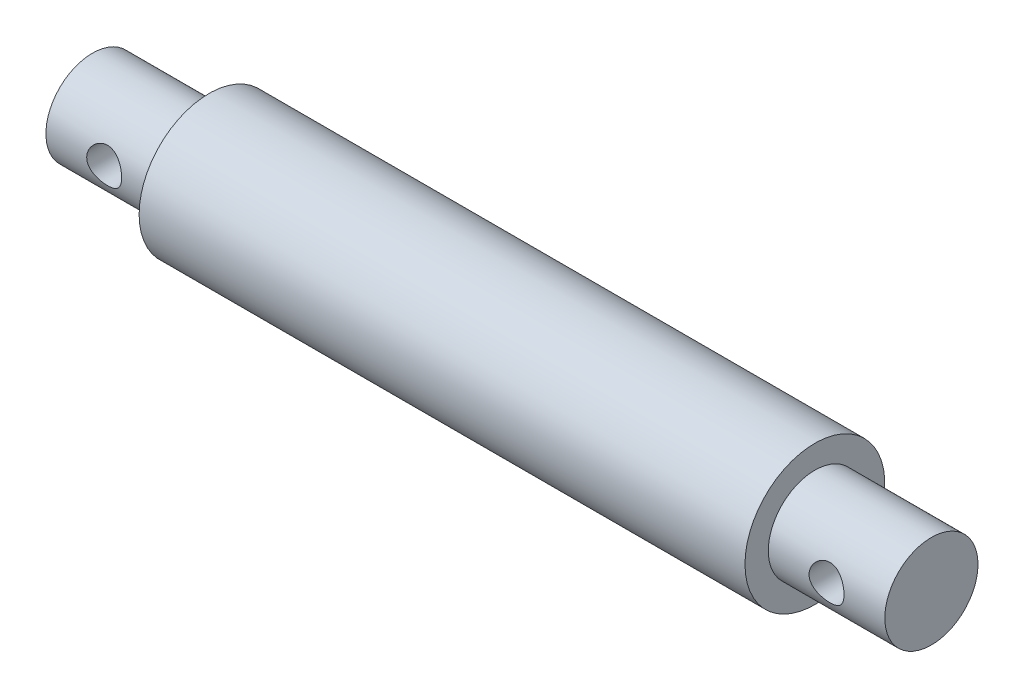
ISO-10303-21;
HEADER;
FILE_DESCRIPTION(('STEP AP214'),'2;1');
FILE_NAME('part.step','',(''),(''),'','','');
FILE_SCHEMA(('AUTOMOTIVE_DESIGN { 1 0 10303 214 1 1 1 1 }'));
ENDSEC;
DATA;
#1=APPLICATION_CONTEXT('core data for automotive mechanical design processes');
#2=APPLICATION_PROTOCOL_DEFINITION('international standard','automotive_design',2000,#1);
#3=PRODUCT_CONTEXT('',#1,'mechanical');
#4=PRODUCT('Part','Part','',(#3));
#5=PRODUCT_RELATED_PRODUCT_CATEGORY('part','',(#4));
#6=PRODUCT_DEFINITION_FORMATION('','',#4);
#7=PRODUCT_DEFINITION_CONTEXT('part definition',#1,'design');
#8=PRODUCT_DEFINITION('design','',#6,#7);
#9=PRODUCT_DEFINITION_SHAPE('','',#8);
#10=(LENGTH_UNIT() NAMED_UNIT(*) SI_UNIT(.MILLI.,.METRE.));
#11=(NAMED_UNIT(*) PLANE_ANGLE_UNIT() SI_UNIT($,.RADIAN.));
#12=(NAMED_UNIT(*) SI_UNIT($,.STERADIAN.) SOLID_ANGLE_UNIT());
#13=UNCERTAINTY_MEASURE_WITH_UNIT(LENGTH_MEASURE(1.E-05),#10,'distance_accuracy_value','');
#14=(GEOMETRIC_REPRESENTATION_CONTEXT(3) GLOBAL_UNCERTAINTY_ASSIGNED_CONTEXT((#13)) GLOBAL_UNIT_ASSIGNED_CONTEXT((#10,
#11,#12)) REPRESENTATION_CONTEXT('',''));
#15=CARTESIAN_POINT('',(0.,0.,0.));
#16=DIRECTION('',(0.,0.,1.));
#17=DIRECTION('',(1.,0.,0.));
#18=AXIS2_PLACEMENT_3D('',#15,#16,#17);
#19=CARTESIAN_POINT('',(5.,0.,0.));
#20=DIRECTION('',(-1.,0.,0.));
#21=DIRECTION('',(0.,0.,1.));
#22=AXIS2_PLACEMENT_3D('',#19,#20,#21);
#23=CYLINDRICAL_SURFACE('',#22,2.);
#24=CARTESIAN_POINT('',(3.24999999999999,0.,2.));
#25=CARTESIAN_POINT('',(3.25000145115156,-0.0406175294689257,2.00000108728076));
#26=CARTESIAN_POINT('',(3.24669011987583,-0.0812251208908955,1.99875189641592));
#27=CARTESIAN_POINT('',(3.23358590236508,-0.161226726176182,1.99389348003464));
#28=CARTESIAN_POINT('',(3.22379394976477,-0.200620913993812,1.99028459446997));
#29=CARTESIAN_POINT('',(3.1981234991142,-0.277030392495449,1.98109416195772));
#30=CARTESIAN_POINT('',(3.18225674158919,-0.314050112081152,1.9755164217472));
#31=CARTESIAN_POINT('',(3.1449467934922,-0.38489965508015,1.96294383882676));
#32=CARTESIAN_POINT('',(3.12350210722804,-0.418728619588968,1.95594861613773));
#33=CARTESIAN_POINT('',(3.07469373446469,-0.483673208522954,1.94093123485607));
#34=CARTESIAN_POINT('',(3.04713486887045,-0.514635365075644,1.93288001291782));
#35=CARTESIAN_POINT('',(2.98729478267075,-0.57162210737188,1.91680110435662));
#36=CARTESIAN_POINT('',(2.95501212195624,-0.597645181796087,1.90877342567514));
#37=CARTESIAN_POINT('',(2.88514126623859,-0.64499101108002,1.89331235308863));
#38=CARTESIAN_POINT('',(2.84739781672729,-0.666096965978905,1.88591324410406));
#39=CARTESIAN_POINT('',(2.76857582291595,-0.701593231670554,1.87299930118712));
#40=CARTESIAN_POINT('',(2.72749861842267,-0.71598622480634,1.86748371487935));
#41=CARTESIAN_POINT('',(2.64494162987112,-0.737042155087917,1.85927206412061));
#42=CARTESIAN_POINT('',(2.6035474807825,-0.743997966092973,1.85646962175412));
#43=CARTESIAN_POINT('',(2.5200919210033,-0.750897782658449,1.85369030730599));
#44=CARTESIAN_POINT('',(2.47803079306298,-0.750844684013374,1.85371226829644));
#45=CARTESIAN_POINT('',(2.39711523739373,-0.743952148050336,1.85648755816018));
#46=CARTESIAN_POINT('',(2.35821954697812,-0.737519042545274,1.85907734435551));
#47=CARTESIAN_POINT('',(2.28210642479755,-0.718720839341929,1.86642469029754));
#48=CARTESIAN_POINT('',(2.24488924669326,-0.706354848316582,1.87118257649421));
#49=CARTESIAN_POINT('',(2.17236146613608,-0.675818742859832,1.88242851095115));
#50=CARTESIAN_POINT('',(2.13710025693954,-0.657543243685829,1.88894758994072));
#51=CARTESIAN_POINT('',(2.0700271312047,-0.615780368813839,1.90297105069648));
#52=CARTESIAN_POINT('',(2.03821641124033,-0.592291193644845,1.91047577228568));
#53=CARTESIAN_POINT('',(1.97669816817473,-0.53890890383313,1.92624019429546));
#54=CARTESIAN_POINT('',(1.94727567962612,-0.508691493585176,1.93451673727825));
#55=CARTESIAN_POINT('',(1.89383101689725,-0.443656295409931,1.95045864082033));
#56=CARTESIAN_POINT('',(1.8698096726973,-0.408837801749113,1.95812390732967));
#57=CARTESIAN_POINT('',(1.82753480146885,-0.334861718496657,1.97213197404533));
#58=CARTESIAN_POINT('',(1.80937620938957,-0.295645356922811,1.97845249129802));
#59=CARTESIAN_POINT('',(1.78000869786505,-0.21441842526275,1.98889359163476));
#60=CARTESIAN_POINT('',(1.76879669171949,-0.172409105423345,1.99301515170742));
#61=CARTESIAN_POINT('',(1.75418860622906,-0.0891876215747927,1.99842221614031));
#62=CARTESIAN_POINT('',(1.75040869680876,-0.0480518097815616,1.99984684512845));
#63=CARTESIAN_POINT('',(1.74965446805002,0.0342862376270601,2.00012946850061));
#64=CARTESIAN_POINT('',(1.75267863984157,0.075488456491236,1.99898803193424));
#65=CARTESIAN_POINT('',(1.76515502115429,0.155131024280497,1.99435854886334));
#66=CARTESIAN_POINT('',(1.77435577186852,0.193616664003252,1.9909623548119));
#67=CARTESIAN_POINT('',(1.79859303627354,0.26847087747817,1.98225738545831));
#68=CARTESIAN_POINT('',(1.81363030897379,0.304839175173286,1.97694836140899));
#69=CARTESIAN_POINT('',(1.84959320621976,0.375623882554734,1.96474812203976));
#70=CARTESIAN_POINT('',(1.87067886461208,0.409951541778737,1.95781500105162));
#71=CARTESIAN_POINT('',(1.91795905158512,0.474696355862675,1.94313335781862));
#72=CARTESIAN_POINT('',(1.94415546627049,0.505112060133928,1.93538453502976));
#73=CARTESIAN_POINT('',(2.00270206106399,0.56301539937286,1.91936664747402));
#74=CARTESIAN_POINT('',(2.03532109139396,0.590230770621167,1.91109348259145));
#75=CARTESIAN_POINT('',(2.10482569234581,0.63885525015548,1.8953940786617));
#76=CARTESIAN_POINT('',(2.14171164566485,0.660263837058458,1.88796791570031));
#77=CARTESIAN_POINT('',(2.21900799340745,0.696688867604872,1.87483414938669));
#78=CARTESIAN_POINT('',(2.25943237304833,0.711678427280095,1.86913380266559));
#79=CARTESIAN_POINT('',(2.34250488194133,0.734539417380815,1.86027016547269));
#80=CARTESIAN_POINT('',(2.38515161812898,0.742415251539542,1.85710530555177));
#81=CARTESIAN_POINT('',(2.46850807975134,0.750431735478515,1.85387947371536));
#82=CARTESIAN_POINT('',(2.50916631585312,0.751036657476174,1.85363222255052));
#83=CARTESIAN_POINT('',(2.58997265814292,0.745683578210571,1.85579206379281));
#84=CARTESIAN_POINT('',(2.6301208123369,0.739726199251178,1.85819890451207));
#85=CARTESIAN_POINT('',(2.70752361335676,0.721779078150335,1.86524070791026));
#86=CARTESIAN_POINT('',(2.74482917312211,0.709978991582282,1.86980542687882));
#87=CARTESIAN_POINT('',(2.81695275424736,0.680848483899663,1.88060774149383));
#88=CARTESIAN_POINT('',(2.85177014403497,0.663516664724658,1.88684575997737));
#89=CARTESIAN_POINT('',(2.91991339484853,0.622760379690614,1.90069861951854));
#90=CARTESIAN_POINT('',(2.95306539839975,0.599064164014947,1.9083684922045));
#91=CARTESIAN_POINT('',(3.01507078048547,0.546672428649476,1.92403123378626));
#92=CARTESIAN_POINT('',(3.04392278739323,0.517975320063985,1.93202420471584));
#93=CARTESIAN_POINT('',(3.09810097791077,0.454540198392265,1.94795212304931));
#94=CARTESIAN_POINT('',(3.1231518767172,0.419559322106461,1.95586052450321));
#95=CARTESIAN_POINT('',(3.16701132763817,0.345606611600394,1.97027257228518));
#96=CARTESIAN_POINT('',(3.18581939386809,0.306634467045301,1.97677610925781));
#97=CARTESIAN_POINT('',(3.21718841452409,0.223999541001155,1.98787146303339));
#98=CARTESIAN_POINT('',(3.22944353230089,0.180206711117105,1.99236828579178));
#99=CARTESIAN_POINT('',(3.24584647996031,0.0909378668031935,1.99843121089794));
#100=CARTESIAN_POINT('',(3.24999837574364,0.0454627081824313,1.99999878301984));
#101=CARTESIAN_POINT('',(3.24999999999999,0.,2.));
#102=B_SPLINE_CURVE_WITH_KNOTS('',3,(#24,#25,#26,#27,#28,#29,#30,#31,#32,#33,#34,#35,#36,#37,
#38,#39,#40,#41,#42,#43,#44,#45,#46,#47,#48,#49,#50,#51,#52,#53,#54,#55,#56,#57,#58,#59,#60,#61,
#62,#63,#64,#65,#66,#67,#68,#69,#70,#71,#72,#73,#74,#75,#76,#77,#78,#79,#80,#81,#82,#83,#84,#85,
#86,#87,#88,#89,#90,#91,#92,#93,#94,#95,#96,#97,#98,#99,#100,#101),.UNSPECIFIED.,.T.,.F.,(4,2,2,
2,2,2,2,2,2,2,2,2,2,2,2,2,2,2,2,2,2,2,2,2,2,2,2,2,2,2,2,2,2,2,2,2,2,2,4),(0.,0.121684900780278,
0.243352274765226,0.36478568460678,0.486251689804735,0.612368092913565,0.738523024628093,
0.869483372508282,1.00039134676066,1.12592937208451,1.25141553039854,1.36939172559986,
1.48738569030295,1.60761204193508,1.72787995372127,1.85623076667904,1.9846012895253,
2.11495687643035,2.24525449849421,2.36862509817962,2.49196834195261,2.61057218961921,
2.72919146627228,2.851296109298,2.97344590009933,3.10268259727827,3.23193089460067,
3.36171533360997,3.49141937472666,3.6127938173454,3.73415675100044,3.85181571207682,
3.96950443322669,4.09336235936551,4.21725970992945,4.34786164821433,4.47847374896964,
4.61474257510435,4.75094300892478),.UNSPECIFIED.);
#103=CARTESIAN_POINT('',(3.24999999999999,0.,2.));
#104=VERTEX_POINT('',#103);
#105=EDGE_CURVE('E45',#104,#104,#102,.T.);
#106=ORIENTED_EDGE('',*,*,#105,.T.);
#107=EDGE_LOOP('',(#106));
#108=FACE_BOUND('',#107,.T.);
#109=CARTESIAN_POINT('',(3.24999999999999,-2.16778004708061E-13,-2.));
#110=CARTESIAN_POINT('',(3.25000145115155,0.0406175294687087,-2.00000108728076));
#111=CARTESIAN_POINT('',(3.2466901198758,0.0812251208906775,-1.99875189641593));
#112=CARTESIAN_POINT('',(3.23358590236503,0.16122672617596,-1.99389348003466));
#113=CARTESIAN_POINT('',(3.22379394976471,0.200620913993587,-1.99028459446999));
#114=CARTESIAN_POINT('',(3.19812349911412,0.277030392495218,-1.98109416195776));
#115=CARTESIAN_POINT('',(3.1822567415891,0.314050112080917,-1.97551642174724));
#116=CARTESIAN_POINT('',(3.14494679349209,0.384899655079905,-1.96294383882681));
#117=CARTESIAN_POINT('',(3.12350210722792,0.418728619588718,-1.95594861613779));
#118=CARTESIAN_POINT('',(3.07469373446454,0.48367320852269,-1.94093123485614));
#119=CARTESIAN_POINT('',(3.0471348688703,0.514635365075373,-1.93288001291789));
#120=CARTESIAN_POINT('',(2.98729478267058,0.571622107371592,-1.9168011043567));
#121=CARTESIAN_POINT('',(2.95501212195606,0.597645181795789,-1.90877342567524));
#122=CARTESIAN_POINT('',(2.8851412662384,0.644991011079701,-1.89331235308874));
#123=CARTESIAN_POINT('',(2.8473978167271,0.666096965978574,-1.88591324410417));
#124=CARTESIAN_POINT('',(2.76857582291575,0.701593231670198,-1.87299930118725));
#125=CARTESIAN_POINT('',(2.72749861842246,0.715986224805973,-1.86748371487949));
#126=CARTESIAN_POINT('',(2.64494162987091,0.737042155087524,-1.85927206412077));
#127=CARTESIAN_POINT('',(2.60354748078229,0.743997966092569,-1.85646962175428));
#128=CARTESIAN_POINT('',(2.52009192100309,0.750897782658021,-1.85369030730616));
#129=CARTESIAN_POINT('',(2.47803079306277,0.750844684012935,-1.85371226829661));
#130=CARTESIAN_POINT('',(2.39711523739353,0.743952148049874,-1.85648755816036));
#131=CARTESIAN_POINT('',(2.35821954697792,0.737519042544801,-1.8590773443557));
#132=CARTESIAN_POINT('',(2.28210642479734,0.718720839341434,-1.86642469029773));
#133=CARTESIAN_POINT('',(2.24488924669306,0.706354848316075,-1.8711825764944));
#134=CARTESIAN_POINT('',(2.17236146613588,0.675818742859302,-1.88242851095134));
#135=CARTESIAN_POINT('',(2.13710025693934,0.657543243685285,-1.88894758994091));
#136=CARTESIAN_POINT('',(2.07002713120451,0.615780368813268,-1.90297105069667));
#137=CARTESIAN_POINT('',(2.03821641124014,0.592291193644261,-1.91047577228586));
#138=CARTESIAN_POINT('',(1.97669816817455,0.538908903832521,-1.92624019429563));
#139=CARTESIAN_POINT('',(1.94727567962594,0.508691493584554,-1.93451673727841));
#140=CARTESIAN_POINT('',(1.89383101689709,0.443656295409285,-1.95045864082048));
#141=CARTESIAN_POINT('',(1.86980967269716,0.408837801748457,-1.95812390732981));
#142=CARTESIAN_POINT('',(1.82753480146873,0.334861718495984,-1.97213197404544));
#143=CARTESIAN_POINT('',(1.80937620938946,0.295645356922135,-1.97845249129812));
#144=CARTESIAN_POINT('',(1.78000869786497,0.214418425262069,-1.98889359163483));
#145=CARTESIAN_POINT('',(1.76879669171944,0.172409105422662,-1.99301515170748));
#146=CARTESIAN_POINT('',(1.75418860622903,0.089187621574113,-1.99842221614034));
#147=CARTESIAN_POINT('',(1.75040869680874,0.0480518097808855,-1.99984684512846));
#148=CARTESIAN_POINT('',(1.74965446805003,-0.0342862376277258,-2.0001294685006));
#149=CARTESIAN_POINT('',(1.7526786398416,-0.0754884564918951,-1.99898803193422));
#150=CARTESIAN_POINT('',(1.76515502115434,-0.155131024281146,-1.99435854886329));
#151=CARTESIAN_POINT('',(1.77435577186857,-0.193616664003896,-1.99096235481184));
#152=CARTESIAN_POINT('',(1.79859303627362,-0.268470877478804,-1.98225738545823));
#153=CARTESIAN_POINT('',(1.81363030897388,-0.304839175173914,-1.97694836140889));
#154=CARTESIAN_POINT('',(1.84959320621987,-0.375623882555352,-1.96474812203964));
#155=CARTESIAN_POINT('',(1.8706788646122,-0.409951541779351,-1.95781500105149));
#156=CARTESIAN_POINT('',(1.91795905158526,-0.474696355863281,-1.94313335781847));
#157=CARTESIAN_POINT('',(1.94415546627064,-0.505112060134527,-1.9353845350296));
#158=CARTESIAN_POINT('',(2.00270206106417,-0.563015399373447,-1.91936664747385));
#159=CARTESIAN_POINT('',(2.03532109139414,-0.590230770621746,-1.91109348259127));
#160=CARTESIAN_POINT('',(2.10482569234602,-0.638855250156041,-1.89539407866151));
#161=CARTESIAN_POINT('',(2.14171164566507,-0.66026383705901,-1.88796791570011));
#162=CARTESIAN_POINT('',(2.21900799340769,-0.6966888676054,-1.8748341493865));
#163=CARTESIAN_POINT('',(2.25943237304857,-0.711678427280609,-1.8691338026654));
#164=CARTESIAN_POINT('',(2.34250488194157,-0.734539417381301,-1.8602701654725));
#165=CARTESIAN_POINT('',(2.38515161812923,-0.742415251540014,-1.85710530555158));
#166=CARTESIAN_POINT('',(2.46850807975159,-0.750431735478958,-1.85387947371518));
#167=CARTESIAN_POINT('',(2.50916631585336,-0.751036657476604,-1.85363222255035));
#168=CARTESIAN_POINT('',(2.58997265814315,-0.745683578210976,-1.85579206379264));
#169=CARTESIAN_POINT('',(2.63012081233713,-0.739726199251572,-1.85819890451191));
#170=CARTESIAN_POINT('',(2.70752361335697,-0.721779078150708,-1.86524070791011));
#171=CARTESIAN_POINT('',(2.74482917312231,-0.709978991582646,-1.86980542687868));
#172=CARTESIAN_POINT('',(2.81695275424754,-0.68084848390001,-1.8806077414937));
#173=CARTESIAN_POINT('',(2.85177014403515,-0.663516664724997,-1.88684575997725));
#174=CARTESIAN_POINT('',(2.9199133948487,-0.622760379690938,-1.90069861951844));
#175=CARTESIAN_POINT('',(2.95306539839991,-0.599064164015262,-1.9083684922044));
#176=CARTESIAN_POINT('',(3.01507078048561,-0.546672428649775,-1.92403123378618));
#177=CARTESIAN_POINT('',(3.04392278739336,-0.517975320064277,-1.93202420471576));
#178=CARTESIAN_POINT('',(3.09810097791089,-0.454540198392541,-1.94795212304925));
#179=CARTESIAN_POINT('',(3.12315187671732,-0.419559322106729,-1.95586052450315));
#180=CARTESIAN_POINT('',(3.16701132763826,-0.345606611600647,-1.97027257228514));
#181=CARTESIAN_POINT('',(3.18581939386817,-0.306634467045547,-1.97677610925777));
#182=CARTESIAN_POINT('',(3.21718841452415,-0.223999541001389,-1.98787146303337));
#183=CARTESIAN_POINT('',(3.22944353230094,-0.180206711117334,-1.99236828579176));
#184=CARTESIAN_POINT('',(3.24584647996033,-0.0909378668034148,-1.99843121089793));
#185=CARTESIAN_POINT('',(3.24999837574366,-0.0454627081826498,-1.99999878301983));
#186=CARTESIAN_POINT('',(3.24999999999999,-2.16778004708061E-13,-2.));
#187=B_SPLINE_CURVE_WITH_KNOTS('',3,(#109,#110,#111,#112,#113,#114,#115,#116,#117,#118,#119,
#120,#121,#122,#123,#124,#125,#126,#127,#128,#129,#130,#131,#132,#133,#134,#135,#136,#137,#138,
#139,#140,#141,#142,#143,#144,#145,#146,#147,#148,#149,#150,#151,#152,#153,#154,#155,#156,#157,
#158,#159,#160,#161,#162,#163,#164,#165,#166,#167,#168,#169,#170,#171,#172,#173,#174,#175,#176,
#177,#178,#179,#180,#181,#182,#183,#184,#185,#186),.UNSPECIFIED.,.T.,.F.,(4,2,2,2,2,2,2,2,2,2,2,
2,2,2,2,2,2,2,2,2,2,2,2,2,2,2,2,2,2,2,2,2,2,2,2,2,2,2,4),(0.,0.121684900780277,
0.243352274765224,0.364785684606778,0.486251689804733,0.612368092913561,0.738523024628086,
0.869483372508267,1.00039134676064,1.12592937208448,1.25141553039851,1.36939172559983,
1.48738569030293,1.60761204193508,1.72787995372128,1.85623076667905,1.98460128952532,
2.11495687643036,2.24525449849421,2.3686250981796,2.49196834195257,2.61057218961917,
2.72919146627223,2.85129610929797,2.97344590009931,3.10268259727827,3.23193089460069,
3.36171533360998,3.49141937472667,3.61279381734539,3.73415675100043,3.85181571207679,
3.96950443322665,4.09336235936547,4.21725970992942,4.34786164821431,4.47847374896963,
4.61474257510434,4.75094300892478),.UNSPECIFIED.);
#188=CARTESIAN_POINT('',(3.24999999999999,-2.16778004708061E-13,-2.));
#189=VERTEX_POINT('',#188);
#190=EDGE_CURVE('E104',#189,#189,#187,.T.);
#191=ORIENTED_EDGE('',*,*,#190,.T.);
#192=EDGE_LOOP('',(#191));
#193=FACE_BOUND('',#192,.T.);
#194=CARTESIAN_POINT('',(5.,0.,0.));
#195=DIRECTION('',(1.,0.,0.));
#196=DIRECTION('',(0.,0.,-1.));
#197=AXIS2_PLACEMENT_3D('',#194,#195,#196);
#198=CIRCLE('',#197,2.);
#199=CARTESIAN_POINT('',(5.,0.,-2.));
#200=VERTEX_POINT('',#199);
#201=EDGE_CURVE('E54',#200,#200,#198,.T.);
#202=ORIENTED_EDGE('',*,*,#201,.F.);
#203=EDGE_LOOP('',(#202));
#204=FACE_BOUND('',#203,.T.);
#205=CARTESIAN_POINT('',(0.,0.,0.));
#206=DIRECTION('',(1.,0.,0.));
#207=DIRECTION('',(0.,0.,-1.));
#208=AXIS2_PLACEMENT_3D('',#205,#206,#207);
#209=CIRCLE('',#208,2.);
#210=CARTESIAN_POINT('',(0.,0.,-2.));
#211=VERTEX_POINT('',#210);
#212=EDGE_CURVE('E60',#211,#211,#209,.T.);
#213=ORIENTED_EDGE('',*,*,#212,.T.);
#214=EDGE_LOOP('',(#213));
#215=FACE_BOUND('',#214,.T.);
#216=ADVANCED_FACE('F41',(#108,#193,#204,#215),#23,.T.);
#217=CARTESIAN_POINT('',(0.,0.,0.));
#218=DIRECTION('',(1.,0.,0.));
#219=DIRECTION('',(0.,0.,-1.));
#220=AXIS2_PLACEMENT_3D('',#217,#218,#219);
#221=PLANE('',#220);
#222=ORIENTED_EDGE('',*,*,#212,.F.);
#223=EDGE_LOOP('',(#222));
#224=FACE_BOUND('',#223,.T.);
#225=ADVANCED_FACE('F132',(#224),#221,.F.);
#226=CARTESIAN_POINT('',(31.,0.,0.));
#227=DIRECTION('',(-1.,0.,0.));
#228=DIRECTION('',(0.,0.,1.));
#229=AXIS2_PLACEMENT_3D('',#226,#227,#228);
#230=CYLINDRICAL_SURFACE('',#229,3.);
#231=CARTESIAN_POINT('',(31.,0.,0.));
#232=DIRECTION('',(1.,0.,0.));
#233=DIRECTION('',(0.,0.,-1.));
#234=AXIS2_PLACEMENT_3D('',#231,#232,#233);
#235=CIRCLE('',#234,3.);
#236=CARTESIAN_POINT('',(31.,0.,3.));
#237=VERTEX_POINT('',#236);
#238=EDGE_CURVE('E65',#237,#237,#235,.T.);
#239=CARTESIAN_POINT('',(5.,0.,0.));
#240=DIRECTION('',(1.,0.,0.));
#241=DIRECTION('',(0.,0.,-1.));
#242=AXIS2_PLACEMENT_3D('',#239,#240,#241);
#243=CIRCLE('',#242,3.);
#244=CARTESIAN_POINT('',(5.,0.,3.));
#245=VERTEX_POINT('',#244);
#246=EDGE_CURVE('E69',#245,#245,#243,.T.);
#247=CARTESIAN_POINT('',(31.,0.,3.));
#248=CARTESIAN_POINT('',(30.7291666666667,0.,3.));
#249=CARTESIAN_POINT('',(30.4583333333333,0.,3.));
#250=CARTESIAN_POINT('',(29.9166666666667,0.,3.));
#251=CARTESIAN_POINT('',(29.6458333333333,0.,3.));
#252=CARTESIAN_POINT('',(29.1041666666667,0.,3.));
#253=CARTESIAN_POINT('',(28.8333333333333,0.,3.));
#254=CARTESIAN_POINT('',(28.2916666666667,0.,3.));
#255=CARTESIAN_POINT('',(28.0208333333333,0.,3.));
#256=CARTESIAN_POINT('',(27.4791666666667,0.,3.));
#257=CARTESIAN_POINT('',(27.2083333333333,0.,3.));
#258=CARTESIAN_POINT('',(26.6666666666667,0.,3.));
#259=CARTESIAN_POINT('',(26.3958333333333,0.,3.));
#260=CARTESIAN_POINT('',(25.8541666666667,0.,3.));
#261=CARTESIAN_POINT('',(25.5833333333333,0.,3.));
#262=CARTESIAN_POINT('',(25.0416666666667,0.,3.));
#263=CARTESIAN_POINT('',(24.7708333333333,0.,3.));
#264=CARTESIAN_POINT('',(24.2291666666667,0.,3.));
#265=CARTESIAN_POINT('',(23.9583333333333,0.,3.));
#266=CARTESIAN_POINT('',(23.4166666666667,0.,3.));
#267=CARTESIAN_POINT('',(23.1458333333333,0.,3.));
#268=CARTESIAN_POINT('',(22.6041666666667,0.,3.));
#269=CARTESIAN_POINT('',(22.3333333333333,0.,3.));
#270=CARTESIAN_POINT('',(21.7916666666667,0.,3.));
#271=CARTESIAN_POINT('',(21.5208333333333,0.,3.));
#272=CARTESIAN_POINT('',(20.9791666666667,0.,3.));
#273=CARTESIAN_POINT('',(20.7083333333333,0.,3.));
#274=CARTESIAN_POINT('',(20.1666666666667,0.,3.));
#275=CARTESIAN_POINT('',(19.8958333333333,0.,3.));
#276=CARTESIAN_POINT('',(19.3541666666667,0.,3.));
#277=CARTESIAN_POINT('',(19.0833333333333,0.,3.));
#278=CARTESIAN_POINT('',(18.5416666666667,0.,3.));
#279=CARTESIAN_POINT('',(18.2708333333333,0.,3.));
#280=CARTESIAN_POINT('',(17.7291666666667,0.,3.));
#281=CARTESIAN_POINT('',(17.4583333333333,0.,3.));
#282=CARTESIAN_POINT('',(16.9166666666667,0.,3.));
#283=CARTESIAN_POINT('',(16.6458333333333,0.,3.));
#284=CARTESIAN_POINT('',(16.1041666666667,0.,3.));
#285=CARTESIAN_POINT('',(15.8333333333333,0.,3.));
#286=CARTESIAN_POINT('',(15.2916666666667,0.,3.));
#287=CARTESIAN_POINT('',(15.0208333333333,0.,3.));
#288=CARTESIAN_POINT('',(14.4791666666667,0.,3.));
#289=CARTESIAN_POINT('',(14.2083333333333,0.,3.));
#290=CARTESIAN_POINT('',(13.6666666666667,0.,3.));
#291=CARTESIAN_POINT('',(13.3958333333333,0.,3.));
#292=CARTESIAN_POINT('',(12.8541666666667,0.,3.));
#293=CARTESIAN_POINT('',(12.5833333333333,0.,3.));
#294=CARTESIAN_POINT('',(12.0416666666667,0.,3.));
#295=CARTESIAN_POINT('',(11.7708333333333,0.,3.));
#296=CARTESIAN_POINT('',(11.2291666666667,0.,3.));
#297=CARTESIAN_POINT('',(10.9583333333333,0.,3.));
#298=CARTESIAN_POINT('',(10.4166666666667,0.,3.));
#299=CARTESIAN_POINT('',(10.1458333333333,0.,3.));
#300=CARTESIAN_POINT('',(9.60416666666667,0.,3.));
#301=CARTESIAN_POINT('',(9.33333333333333,0.,3.));
#302=CARTESIAN_POINT('',(8.79166666666667,0.,3.));
#303=CARTESIAN_POINT('',(8.52083333333333,0.,3.));
#304=CARTESIAN_POINT('',(7.97916666666667,0.,3.));
#305=CARTESIAN_POINT('',(7.70833333333333,0.,3.));
#306=CARTESIAN_POINT('',(7.16666666666667,0.,3.));
#307=CARTESIAN_POINT('',(6.89583333333333,0.,3.));
#308=CARTESIAN_POINT('',(6.35416666666667,0.,3.));
#309=CARTESIAN_POINT('',(6.08333333333334,0.,3.));
#310=CARTESIAN_POINT('',(5.54166666666667,0.,3.));
#311=CARTESIAN_POINT('',(5.27083333333333,0.,3.));
#312=CARTESIAN_POINT('',(5.,0.,3.));
#313=B_SPLINE_CURVE_WITH_KNOTS('',3,(#247,#248,#249,#250,#251,#252,#253,#254,#255,#256,#257,
#258,#259,#260,#261,#262,#263,#264,#265,#266,#267,#268,#269,#270,#271,#272,#273,#274,#275,#276,
#277,#278,#279,#280,#281,#282,#283,#284,#285,#286,#287,#288,#289,#290,#291,#292,#293,#294,#295,
#296,#297,#298,#299,#300,#301,#302,#303,#304,#305,#306,#307,#308,#309,#310,#311,#312),
.UNSPECIFIED.,.F.,.F.,(4,2,2,2,2,2,2,2,2,2,2,2,2,2,2,2,2,2,2,2,2,2,2,2,2,2,2,2,2,2,2,2,4),(0.,
0.812500000000001,1.625,2.4375,3.25,4.0625,4.875,5.6875,6.5,7.3125,8.125,8.9375,9.75,10.5625,
11.375,12.1875,13.,13.8125,14.625,15.4375,16.25,17.0625,17.875,18.6875,19.5,20.3125,21.125,
21.9375,22.75,23.5625,24.375,25.1875,26.),.UNSPECIFIED.);
#314=EDGE_CURVE('BSEAM137',#237,#245,#313,.T.);
#315=ORIENTED_EDGE('',*,*,#238,.F.);
#316=ORIENTED_EDGE('',*,*,#246,.T.);
#317=ORIENTED_EDGE('',*,*,#314,.T.);
#318=ORIENTED_EDGE('',*,*,#314,.F.);
#319=EDGE_LOOP('',(#315,#317,#316,#318));
#320=FACE_BOUND('',#319,.T.);
#321=ADVANCED_FACE('F137',(#320),#230,.T.);
#322=CARTESIAN_POINT('',(31.,0.,0.));
#323=DIRECTION('',(1.,0.,0.));
#324=DIRECTION('',(0.,0.,-1.));
#325=AXIS2_PLACEMENT_3D('',#322,#323,#324);
#326=PLANE('',#325);
#327=CARTESIAN_POINT('',(31.,0.,0.));
#328=DIRECTION('',(1.,0.,0.));
#329=DIRECTION('',(0.,0.,-1.));
#330=AXIS2_PLACEMENT_3D('',#327,#328,#329);
#331=CIRCLE('',#330,2.);
#332=CARTESIAN_POINT('',(31.,0.,-2.));
#333=VERTEX_POINT('',#332);
#334=EDGE_CURVE('E10',#333,#333,#331,.T.);
#335=ORIENTED_EDGE('',*,*,#334,.F.);
#336=EDGE_LOOP('',(#335));
#337=FACE_BOUND('',#336,.T.);
#338=ORIENTED_EDGE('',*,*,#238,.T.);
#339=EDGE_LOOP('',(#338));
#340=FACE_BOUND('',#339,.T.);
#341=ADVANCED_FACE('F147',(#337,#340),#326,.T.);
#342=CARTESIAN_POINT('',(5.,0.,0.));
#343=DIRECTION('',(1.,0.,0.));
#344=DIRECTION('',(0.,0.,-1.));
#345=AXIS2_PLACEMENT_3D('',#342,#343,#344);
#346=PLANE('',#345);
#347=ORIENTED_EDGE('',*,*,#201,.T.);
#348=EDGE_LOOP('',(#347));
#349=FACE_BOUND('',#348,.T.);
#350=ORIENTED_EDGE('',*,*,#246,.F.);
#351=EDGE_LOOP('',(#350));
#352=FACE_BOUND('',#351,.T.);
#353=ADVANCED_FACE('F121',(#349,#352),#346,.F.);
#354=CARTESIAN_POINT('',(36.,0.,0.));
#355=DIRECTION('',(-1.,0.,0.));
#356=DIRECTION('',(0.,0.,1.));
#357=AXIS2_PLACEMENT_3D('',#354,#355,#356);
#358=CYLINDRICAL_SURFACE('',#357,2.);
#359=CARTESIAN_POINT('',(34.25,0.,2.));
#360=CARTESIAN_POINT('',(34.2500014511515,-0.0406175294689268,2.00000108728076));
#361=CARTESIAN_POINT('',(34.2466901198758,-0.081225120890897,1.99875189641592));
#362=CARTESIAN_POINT('',(34.233585902365,-0.161226726176181,1.99389348003464));
#363=CARTESIAN_POINT('',(34.2237939497647,-0.200620913993808,1.99028459446997));
#364=CARTESIAN_POINT('',(34.1981234991141,-0.277030392495442,1.98109416195772));
#365=CARTESIAN_POINT('',(34.1822567415891,-0.314050112081143,1.9755164217472));
#366=CARTESIAN_POINT('',(34.1449467934921,-0.384899655080131,1.96294383882677));
#367=CARTESIAN_POINT('',(34.1235021072279,-0.418728619588942,1.95594861613774));
#368=CARTESIAN_POINT('',(34.0746937344645,-0.483673208522913,1.94093123485608));
#369=CARTESIAN_POINT('',(34.0471348688703,-0.514635365075595,1.93288001291783));
#370=CARTESIAN_POINT('',(33.9872947826706,-0.571622107371815,1.91680110435663));
#371=CARTESIAN_POINT('',(33.9550121219561,-0.597645181796014,1.90877342567516));
#372=CARTESIAN_POINT('',(33.8851412662384,-0.644991011079926,1.89331235308866));
#373=CARTESIAN_POINT('',(33.8473978167271,-0.666096965978799,1.88591324410409));
#374=CARTESIAN_POINT('',(33.7685758229157,-0.701593231670422,1.87299930118717));
#375=CARTESIAN_POINT('',(33.7274986184224,-0.715986224806196,1.8674837148794));
#376=CARTESIAN_POINT('',(33.6449416298709,-0.737042155087745,1.85927206412068));
#377=CARTESIAN_POINT('',(33.6035474807823,-0.743997966092788,1.85646962175419));
#378=CARTESIAN_POINT('',(33.5200919210031,-0.750897782658239,1.85369030730607));
#379=CARTESIAN_POINT('',(33.4780307930628,-0.750844684013151,1.85371226829652));
#380=CARTESIAN_POINT('',(33.3971152373935,-0.743952148050089,1.85648755816027));
#381=CARTESIAN_POINT('',(33.3582195469779,-0.737519042545016,1.85907734435561));
#382=CARTESIAN_POINT('',(33.2821064247973,-0.718720839341648,1.86642469029765));
#383=CARTESIAN_POINT('',(33.244889246693,-0.706354848316289,1.87118257649432));
#384=CARTESIAN_POINT('',(33.1723614661359,-0.675818742859516,1.88242851095127));
#385=CARTESIAN_POINT('',(33.1371002569393,-0.657543243685499,1.88894758994083));
#386=CARTESIAN_POINT('',(33.0700271312045,-0.615780368813486,1.9029710506966));
#387=CARTESIAN_POINT('',(33.0382164112401,-0.592291193644481,1.91047577228579));
#388=CARTESIAN_POINT('',(32.9766981681746,-0.538908903832742,1.92624019429557));
#389=CARTESIAN_POINT('',(32.947275679626,-0.508691493584775,1.93451673727835));
#390=CARTESIAN_POINT('',(32.8938310168971,-0.443656295409507,1.95045864082043));
#391=CARTESIAN_POINT('',(32.8698096726972,-0.408837801748679,1.95812390732976));
#392=CARTESIAN_POINT('',(32.8275348014687,-0.334861718496206,1.9721319740454));
#393=CARTESIAN_POINT('',(32.8093762093895,-0.295645356922356,1.97845249129808));
#394=CARTESIAN_POINT('',(32.780008697865,-0.214418425262288,1.98889359163481));
#395=CARTESIAN_POINT('',(32.7687966917194,-0.172409105422881,1.99301515170746));
#396=CARTESIAN_POINT('',(32.754188606229,-0.0891876215743301,1.99842221614033));
#397=CARTESIAN_POINT('',(32.7504086968087,-0.0480518097811011,1.99984684512846));
#398=CARTESIAN_POINT('',(32.74965446805,0.034286237627513,2.0001294685006));
#399=CARTESIAN_POINT('',(32.7526786398416,0.0754884564916837,1.99898803193422));
#400=CARTESIAN_POINT('',(32.7651550211543,0.155131024280937,1.99435854886331));
#401=CARTESIAN_POINT('',(32.7743557718686,0.193616664003688,1.99096235481185));
#402=CARTESIAN_POINT('',(32.7985930362736,0.268470877478597,1.98225738545826));
#403=CARTESIAN_POINT('',(32.8136303089739,0.304839175173707,1.97694836140892));
#404=CARTESIAN_POINT('',(32.8495932062199,0.375623882555142,1.96474812203968));
#405=CARTESIAN_POINT('',(32.8706788646122,0.40995154177914,1.95781500105154));
#406=CARTESIAN_POINT('',(32.9179590515853,0.474696355863068,1.94313335781852));
#407=CARTESIAN_POINT('',(32.9441554662707,0.505112060134315,1.93538453502966));
#408=CARTESIAN_POINT('',(33.0027020610642,0.563015399373234,1.91936664747391));
#409=CARTESIAN_POINT('',(33.0353210913941,0.590230770621531,1.91109348259133));
#410=CARTESIAN_POINT('',(33.104825692346,0.638855250155824,1.89539407866158));
#411=CARTESIAN_POINT('',(33.1417116456651,0.660263837058794,1.88796791570019));
#412=CARTESIAN_POINT('',(33.2190079934077,0.696688867605184,1.87483414938657));
#413=CARTESIAN_POINT('',(33.2594323730486,0.711678427280394,1.86913380266548));
#414=CARTESIAN_POINT('',(33.3425048819416,0.734539417381085,1.86027016547258));
#415=CARTESIAN_POINT('',(33.3851516181292,0.742415251539797,1.85710530555167));
#416=CARTESIAN_POINT('',(33.4685080797516,0.750431735478741,1.85387947371526));
#417=CARTESIAN_POINT('',(33.5091663158534,0.751036657476387,1.85363222255043));
#418=CARTESIAN_POINT('',(33.5899726581432,0.745683578210759,1.85579206379273));
#419=CARTESIAN_POINT('',(33.6301208123371,0.739726199251355,1.858198904512));
#420=CARTESIAN_POINT('',(33.707523613357,0.721779078150489,1.86524070791019));
#421=CARTESIAN_POINT('',(33.7448291731223,0.709978991582425,1.86980542687876));
#422=CARTESIAN_POINT('',(33.8169527542476,0.680848483899788,1.88060774149378));
#423=CARTESIAN_POINT('',(33.8517701440352,0.663516664724774,1.88684575997732));
#424=CARTESIAN_POINT('',(33.9199133948487,0.622760379690711,1.90069861951851));
#425=CARTESIAN_POINT('',(33.9530653983999,0.599064164015033,1.90836849220447));
#426=CARTESIAN_POINT('',(34.0150707804856,0.546672428649541,1.92403123378624));
#427=CARTESIAN_POINT('',(34.0439227873934,0.517975320064042,1.93202420471582));
#428=CARTESIAN_POINT('',(34.0981009779109,0.454540198392303,1.9479521230493));
#429=CARTESIAN_POINT('',(34.1231518767173,0.419559322106489,1.9558605245032));
#430=CARTESIAN_POINT('',(34.1670113276383,0.345606611600406,1.97027257228518));
#431=CARTESIAN_POINT('',(34.1858193938682,0.306634467045307,1.9767761092578));
#432=CARTESIAN_POINT('',(34.2171884145242,0.223999541001153,1.98787146303339));
#433=CARTESIAN_POINT('',(34.2294435323009,0.180206711117101,1.99236828579178));
#434=CARTESIAN_POINT('',(34.2458464799603,0.0909378668031894,1.99843121089794));
#435=CARTESIAN_POINT('',(34.2499983757437,0.0454627081824288,1.99999878301984));
#436=CARTESIAN_POINT('',(34.25,0.,2.));
#437=B_SPLINE_CURVE_WITH_KNOTS('',3,(#359,#360,#361,#362,#363,#364,#365,#366,#367,#368,#369,
#370,#371,#372,#373,#374,#375,#376,#377,#378,#379,#380,#381,#382,#383,#384,#385,#386,#387,#388,
#389,#390,#391,#392,#393,#394,#395,#396,#397,#398,#399,#400,#401,#402,#403,#404,#405,#406,#407,
#408,#409,#410,#411,#412,#413,#414,#415,#416,#417,#418,#419,#420,#421,#422,#423,#424,#425,#426,
#427,#428,#429,#430,#431,#432,#433,#434,#435,#436),.UNSPECIFIED.,.T.,.F.,(4,2,2,2,2,2,2,2,2,2,2,
2,2,2,2,2,2,2,2,2,2,2,2,2,2,2,2,2,2,2,2,2,2,2,2,2,2,2,4),(0.,0.121684900780281,
0.243352274765231,0.364785684606795,0.486251689804746,0.612368092913578,0.738523024628111,
0.869483372508295,1.00039134676067,1.12592937208451,1.25141553039853,1.36939172559986,
1.48738569030295,1.60761204193509,1.72787995372129,1.85623076667906,1.98460128952533,
2.11495687643038,2.24525449849423,2.36862509817962,2.4919683419526,2.6105721896192,
2.72919146627226,2.85129610929799,2.97344590009933,3.10268259727828,3.2319308946007,
3.36171533361,3.49141937472668,3.61279381734541,3.73415675100045,3.85181571207681,
3.96950443322668,4.0933623593655,4.21725970992946,4.34786164821434,4.47847374896966,
4.61474257510435,4.75094300892478),.UNSPECIFIED.);
#438=CARTESIAN_POINT('',(34.25,0.,2.));
#439=VERTEX_POINT('',#438);
#440=EDGE_CURVE('E85',#439,#439,#437,.T.);
#441=ORIENTED_EDGE('',*,*,#440,.T.);
#442=EDGE_LOOP('',(#441));
#443=FACE_BOUND('',#442,.T.);
#444=CARTESIAN_POINT('',(34.25,0.,-2.));
#445=CARTESIAN_POINT('',(34.2500014511515,0.0406175294689261,-2.00000108728076));
#446=CARTESIAN_POINT('',(34.2466901198758,0.081225120890896,-1.99875189641592));
#447=CARTESIAN_POINT('',(34.233585902365,0.16122672617618,-1.99389348003464));
#448=CARTESIAN_POINT('',(34.2237939497647,0.200620913993807,-1.99028459446997));
#449=CARTESIAN_POINT('',(34.1981234991141,0.277030392495439,-1.98109416195772));
#450=CARTESIAN_POINT('',(34.1822567415891,0.31405011208114,-1.9755164217472));
#451=CARTESIAN_POINT('',(34.1449467934921,0.384899655080129,-1.96294383882677));
#452=CARTESIAN_POINT('',(34.1235021072279,0.418728619588941,-1.95594861613774));
#453=CARTESIAN_POINT('',(34.0746937344645,0.483673208522913,-1.94093123485608));
#454=CARTESIAN_POINT('',(34.0471348688703,0.514635365075595,-1.93288001291783));
#455=CARTESIAN_POINT('',(33.9872947826706,0.571622107371815,-1.91680110435663));
#456=CARTESIAN_POINT('',(33.9550121219561,0.597645181796013,-1.90877342567516));
#457=CARTESIAN_POINT('',(33.8851412662384,0.644991011079926,-1.89331235308866));
#458=CARTESIAN_POINT('',(33.8473978167271,0.666096965978798,-1.88591324410409));
#459=CARTESIAN_POINT('',(33.7685758229157,0.701593231670421,-1.87299930118717));
#460=CARTESIAN_POINT('',(33.7274986184224,0.715986224806195,-1.86748371487941));
#461=CARTESIAN_POINT('',(33.6449416298709,0.737042155087745,-1.85927206412068));
#462=CARTESIAN_POINT('',(33.6035474807823,0.743997966092788,-1.85646962175419));
#463=CARTESIAN_POINT('',(33.5200919210031,0.750897782658238,-1.85369030730607));
#464=CARTESIAN_POINT('',(33.4780307930628,0.750844684013151,-1.85371226829652));
#465=CARTESIAN_POINT('',(33.3971152373935,0.743952148050089,-1.85648755816027));
#466=CARTESIAN_POINT('',(33.3582195469779,0.737519042545015,-1.85907734435561));
#467=CARTESIAN_POINT('',(33.2821064247973,0.718720839341647,-1.86642469029765));
#468=CARTESIAN_POINT('',(33.244889246693,0.706354848316288,-1.87118257649432));
#469=CARTESIAN_POINT('',(33.1723614661359,0.675818742859515,-1.88242851095127));
#470=CARTESIAN_POINT('',(33.1371002569393,0.657543243685499,-1.88894758994083));
#471=CARTESIAN_POINT('',(33.0700271312045,0.615780368813485,-1.9029710506966));
#472=CARTESIAN_POINT('',(33.0382164112401,0.592291193644481,-1.91047577228579));
#473=CARTESIAN_POINT('',(32.9766981681746,0.538908903832742,-1.92624019429557));
#474=CARTESIAN_POINT('',(32.947275679626,0.508691493584774,-1.93451673727835));
#475=CARTESIAN_POINT('',(32.8938310168971,0.443656295409506,-1.95045864082043));
#476=CARTESIAN_POINT('',(32.8698096726972,0.408837801748678,-1.95812390732976));
#477=CARTESIAN_POINT('',(32.8275348014687,0.334861718496206,-1.9721319740454));
#478=CARTESIAN_POINT('',(32.8093762093895,0.295645356922355,-1.97845249129808));
#479=CARTESIAN_POINT('',(32.780008697865,0.214418425262287,-1.98889359163481));
#480=CARTESIAN_POINT('',(32.7687966917194,0.17240910542288,-1.99301515170746));
#481=CARTESIAN_POINT('',(32.754188606229,0.0891876215743295,-1.99842221614033));
#482=CARTESIAN_POINT('',(32.7504086968087,0.0480518097811008,-1.99984684512846));
#483=CARTESIAN_POINT('',(32.74965446805,-0.0342862376275128,-2.0001294685006));
#484=CARTESIAN_POINT('',(32.7526786398416,-0.0754884564916832,-1.99898803193422));
#485=CARTESIAN_POINT('',(32.7651550211543,-0.155131024280936,-1.99435854886331));
#486=CARTESIAN_POINT('',(32.7743557718686,-0.193616664003688,-1.99096235481185));
#487=CARTESIAN_POINT('',(32.7985930362736,-0.268470877478597,-1.98225738545826));
#488=CARTESIAN_POINT('',(32.8136303089739,-0.304839175173707,-1.97694836140892));
#489=CARTESIAN_POINT('',(32.8495932062199,-0.375623882555143,-1.96474812203968));
#490=CARTESIAN_POINT('',(32.8706788646122,-0.40995154177914,-1.95781500105154));
#491=CARTESIAN_POINT('',(32.9179590515853,-0.474696355863068,-1.94313335781852));
#492=CARTESIAN_POINT('',(32.9441554662707,-0.505112060134315,-1.93538453502966));
#493=CARTESIAN_POINT('',(33.0027020610642,-0.563015399373234,-1.91936664747391));
#494=CARTESIAN_POINT('',(33.0353210913941,-0.590230770621531,-1.91109348259133));
#495=CARTESIAN_POINT('',(33.104825692346,-0.638855250155825,-1.89539407866158));
#496=CARTESIAN_POINT('',(33.1417116456651,-0.660263837058794,-1.88796791570019));
#497=CARTESIAN_POINT('',(33.2190079934077,-0.696688867605185,-1.87483414938657));
#498=CARTESIAN_POINT('',(33.2594323730486,-0.711678427280394,-1.86913380266548));
#499=CARTESIAN_POINT('',(33.3425048819416,-0.734539417381086,-1.86027016547258));
#500=CARTESIAN_POINT('',(33.3851516181292,-0.742415251539797,-1.85710530555167));
#501=CARTESIAN_POINT('',(33.4685080797516,-0.750431735478742,-1.85387947371526));
#502=CARTESIAN_POINT('',(33.5091663158534,-0.751036657476388,-1.85363222255043));
#503=CARTESIAN_POINT('',(33.5899726581432,-0.74568357821076,-1.85579206379273));
#504=CARTESIAN_POINT('',(33.6301208123371,-0.739726199251356,-1.858198904512));
#505=CARTESIAN_POINT('',(33.707523613357,-0.721779078150489,-1.86524070791019));
#506=CARTESIAN_POINT('',(33.7448291731223,-0.709978991582425,-1.86980542687876));
#507=CARTESIAN_POINT('',(33.8169527542476,-0.680848483899789,-1.88060774149378));
#508=CARTESIAN_POINT('',(33.8517701440352,-0.663516664724775,-1.88684575997732));
#509=CARTESIAN_POINT('',(33.9199133948487,-0.622760379690712,-1.90069861951851));
#510=CARTESIAN_POINT('',(33.9530653983999,-0.599064164015034,-1.90836849220447));
#511=CARTESIAN_POINT('',(34.0150707804856,-0.546672428649542,-1.92403123378624));
#512=CARTESIAN_POINT('',(34.0439227873934,-0.517975320064042,-1.93202420471582));
#513=CARTESIAN_POINT('',(34.0981009779109,-0.454540198392304,-1.9479521230493));
#514=CARTESIAN_POINT('',(34.1231518767173,-0.41955932210649,-1.9558605245032));
#515=CARTESIAN_POINT('',(34.1670113276383,-0.345606611600407,-1.97027257228518));
#516=CARTESIAN_POINT('',(34.1858193938682,-0.306634467045308,-1.9767761092578));
#517=CARTESIAN_POINT('',(34.2171884145242,-0.223999541001154,-1.98787146303339));
#518=CARTESIAN_POINT('',(34.2294435323009,-0.180206711117102,-1.99236828579178));
#519=CARTESIAN_POINT('',(34.2458464799603,-0.0909378668031899,-1.99843121089794));
#520=CARTESIAN_POINT('',(34.2499983757437,-0.0454627081824292,-1.99999878301984));
#521=CARTESIAN_POINT('',(34.25,0.,-2.));
#522=B_SPLINE_CURVE_WITH_KNOTS('',3,(#444,#445,#446,#447,#448,#449,#450,#451,#452,#453,#454,
#455,#456,#457,#458,#459,#460,#461,#462,#463,#464,#465,#466,#467,#468,#469,#470,#471,#472,#473,
#474,#475,#476,#477,#478,#479,#480,#481,#482,#483,#484,#485,#486,#487,#488,#489,#490,#491,#492,
#493,#494,#495,#496,#497,#498,#499,#500,#501,#502,#503,#504,#505,#506,#507,#508,#509,#510,#511,
#512,#513,#514,#515,#516,#517,#518,#519,#520,#521),.UNSPECIFIED.,.T.,.F.,(4,2,2,2,2,2,2,2,2,2,2,
2,2,2,2,2,2,2,2,2,2,2,2,2,2,2,2,2,2,2,2,2,2,2,2,2,2,2,4),(0.,0.12168490078028,0.243352274765231,
0.364785684606787,0.486251689804747,0.612368092913579,0.738523024628111,0.869483372508296,
1.00039134676067,1.12592937208451,1.25141553039853,1.36939172559986,1.48738569030295,
1.60761204193509,1.72787995372129,1.85623076667906,1.98460128952533,2.11495687643038,
2.24525449849423,2.36862509817962,2.4919683419526,2.6105721896192,2.72919146627226,
2.85129610929799,2.97344590009933,3.10268259727828,3.2319308946007,3.36171533361,
3.49141937472668,3.61279381734541,3.73415675100045,3.85181571207681,3.96950443322668,
4.0933623593655,4.21725970992946,4.34786164821434,4.47847374896966,4.61474257510435,
4.75094300892478),.UNSPECIFIED.);
#523=CARTESIAN_POINT('',(34.25,0.,-2.));
#524=VERTEX_POINT('',#523);
#525=EDGE_CURVE('E76',#524,#524,#522,.T.);
#526=ORIENTED_EDGE('',*,*,#525,.T.);
#527=EDGE_LOOP('',(#526));
#528=FACE_BOUND('',#527,.T.);
#529=CARTESIAN_POINT('',(36.,0.,0.));
#530=DIRECTION('',(1.,0.,0.));
#531=DIRECTION('',(0.,0.,-1.));
#532=AXIS2_PLACEMENT_3D('',#529,#530,#531);
#533=CIRCLE('',#532,2.);
#534=CARTESIAN_POINT('',(36.,0.,-2.));
#535=VERTEX_POINT('',#534);
#536=EDGE_CURVE('E64',#535,#535,#533,.T.);
#537=ORIENTED_EDGE('',*,*,#536,.F.);
#538=EDGE_LOOP('',(#537));
#539=FACE_BOUND('',#538,.T.);
#540=ORIENTED_EDGE('',*,*,#334,.T.);
#541=EDGE_LOOP('',(#540));
#542=FACE_BOUND('',#541,.T.);
#543=ADVANCED_FACE('F89',(#443,#528,#539,#542),#358,.T.);
#544=CARTESIAN_POINT('',(36.,0.,0.));
#545=DIRECTION('',(1.,0.,0.));
#546=DIRECTION('',(0.,0.,-1.));
#547=AXIS2_PLACEMENT_3D('',#544,#545,#546);
#548=PLANE('',#547);
#549=ORIENTED_EDGE('',*,*,#536,.T.);
#550=EDGE_LOOP('',(#549));
#551=FACE_BOUND('',#550,.T.);
#552=ADVANCED_FACE('F97',(#551),#548,.T.);
#553=CARTESIAN_POINT('',(33.5,0.,-2.5));
#554=DIRECTION('',(0.,0.,1.));
#555=DIRECTION('',(1.,0.,0.));
#556=AXIS2_PLACEMENT_3D('',#553,#554,#555);
#557=CYLINDRICAL_SURFACE('',#556,0.749999999999999);
#558=ORIENTED_EDGE('',*,*,#525,.F.);
#559=EDGE_LOOP('',(#558));
#560=FACE_BOUND('',#559,.T.);
#561=ORIENTED_EDGE('',*,*,#440,.F.);
#562=EDGE_LOOP('',(#561));
#563=FACE_BOUND('',#562,.T.);
#564=ADVANCED_FACE('F93',(#560,#563),#557,.F.);
#565=CARTESIAN_POINT('',(2.5,-2.16778004708061E-13,-2.5));
#566=DIRECTION('',(0.,0.,1.));
#567=DIRECTION('',(1.,0.,0.));
#568=AXIS2_PLACEMENT_3D('',#565,#566,#567);
#569=CYLINDRICAL_SURFACE('',#568,0.749999999999999);
#570=ORIENTED_EDGE('',*,*,#190,.F.);
#571=EDGE_LOOP('',(#570));
#572=FACE_BOUND('',#571,.T.);
#573=ORIENTED_EDGE('',*,*,#105,.F.);
#574=EDGE_LOOP('',(#573));
#575=FACE_BOUND('',#574,.T.);
#576=ADVANCED_FACE('F96',(#572,#575),#569,.F.);
#577=CLOSED_SHELL('',(#216,#225,#321,#341,#353,#543,#552,#564,#576));
#578=MANIFOLD_SOLID_BREP('B2',#577);
#579=ADVANCED_BREP_SHAPE_REPRESENTATION('',(#18,#578),#14);
#580=SHAPE_DEFINITION_REPRESENTATION(#9,#579);
ENDSEC;
END-ISO-10303-21;
